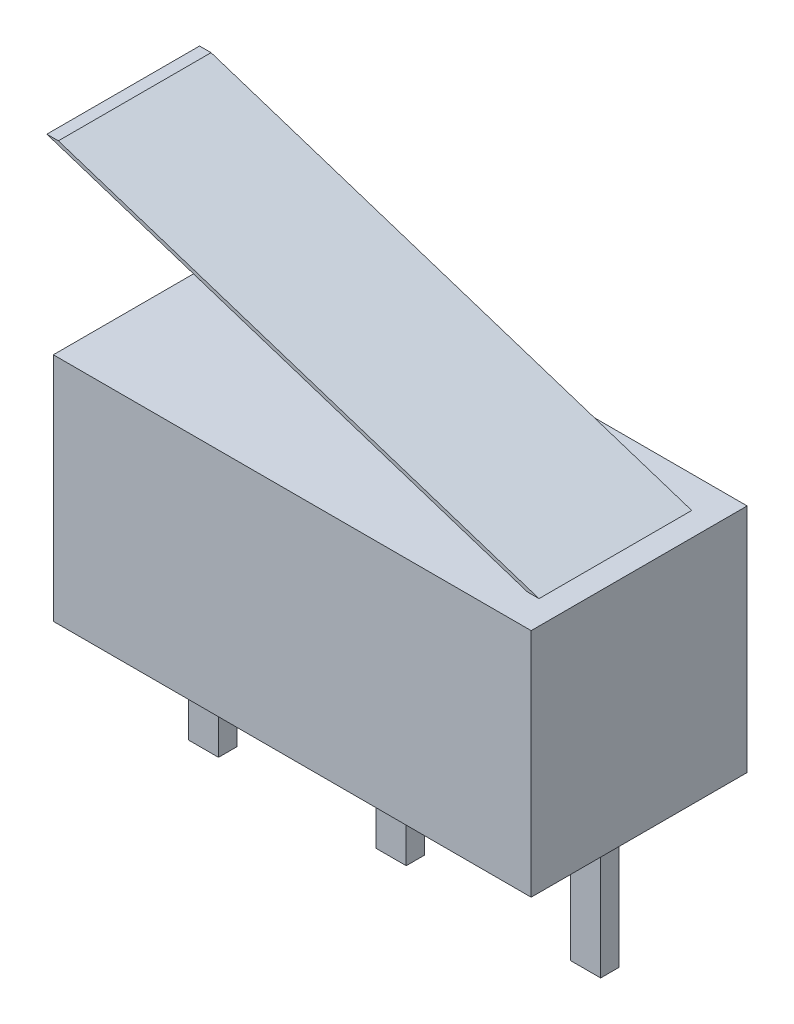
ISO-10303-21;
HEADER;
FILE_DESCRIPTION(('STEP AP214'),'2;1');
FILE_NAME('part.step','',(''),(''),'','','');
FILE_SCHEMA(('AUTOMOTIVE_DESIGN { 1 0 10303 214 1 1 1 1 }'));
ENDSEC;
DATA;
#1=APPLICATION_CONTEXT('core data for automotive mechanical design processes');
#2=APPLICATION_PROTOCOL_DEFINITION('international standard','automotive_design',2000,#1);
#3=PRODUCT_CONTEXT('',#1,'mechanical');
#4=PRODUCT('Part','Part','',(#3));
#5=PRODUCT_RELATED_PRODUCT_CATEGORY('part','',(#4));
#6=PRODUCT_DEFINITION_FORMATION('','',#4);
#7=PRODUCT_DEFINITION_CONTEXT('part definition',#1,'design');
#8=PRODUCT_DEFINITION('design','',#6,#7);
#9=PRODUCT_DEFINITION_SHAPE('','',#8);
#10=(LENGTH_UNIT() NAMED_UNIT(*) SI_UNIT(.MILLI.,.METRE.));
#11=(NAMED_UNIT(*) PLANE_ANGLE_UNIT() SI_UNIT($,.RADIAN.));
#12=(NAMED_UNIT(*) SI_UNIT($,.STERADIAN.) SOLID_ANGLE_UNIT());
#13=UNCERTAINTY_MEASURE_WITH_UNIT(LENGTH_MEASURE(1.E-05),#10,'distance_accuracy_value','');
#14=(GEOMETRIC_REPRESENTATION_CONTEXT(3) GLOBAL_UNCERTAINTY_ASSIGNED_CONTEXT((#13)) GLOBAL_UNIT_ASSIGNED_CONTEXT((#10,
#11,#12)) REPRESENTATION_CONTEXT('',''));
#15=CARTESIAN_POINT('',(0.,0.,0.));
#16=DIRECTION('',(0.,0.,1.));
#17=DIRECTION('',(1.,0.,0.));
#18=AXIS2_PLACEMENT_3D('',#15,#16,#17);
#19=CARTESIAN_POINT('',(0.,0.,0.));
#20=DIRECTION('',(0.,-1.,0.));
#21=DIRECTION('',(0.,0.,-1.));
#22=AXIS2_PLACEMENT_3D('',#19,#20,#21);
#23=PLANE('',#22);
#24=DIRECTION('',(0.,0.,-1.));
#25=VECTOR('',#24,1.);
#26=CARTESIAN_POINT('',(6.415,0.,2.9));
#27=LINE('',#26,#25);
#28=CARTESIAN_POINT('',(6.415,0.,2.9));
#29=VERTEX_POINT('',#28);
#30=CARTESIAN_POINT('',(6.415,0.,-2.9));
#31=VERTEX_POINT('',#30);
#32=EDGE_CURVE('E289',#29,#31,#27,.T.);
#33=ORIENTED_EDGE('',*,*,#32,.F.);
#34=DIRECTION('',(1.,0.,0.));
#35=VECTOR('',#34,1.);
#36=CARTESIAN_POINT('',(-6.415,0.,2.9));
#37=LINE('',#36,#35);
#38=CARTESIAN_POINT('',(-6.415,0.,2.9));
#39=VERTEX_POINT('',#38);
#40=EDGE_CURVE('E294',#39,#29,#37,.T.);
#41=ORIENTED_EDGE('',*,*,#40,.F.);
#42=DIRECTION('',(0.,0.,1.));
#43=VECTOR('',#42,1.);
#44=CARTESIAN_POINT('',(-6.415,0.,2.9));
#45=LINE('',#44,#43);
#46=CARTESIAN_POINT('',(-6.415,0.,-2.9));
#47=VERTEX_POINT('',#46);
#48=EDGE_CURVE('E305',#47,#39,#45,.T.);
#49=ORIENTED_EDGE('',*,*,#48,.F.);
#50=DIRECTION('',(-1.,0.,0.));
#51=VECTOR('',#50,1.);
#52=CARTESIAN_POINT('',(-6.415,0.,-2.9));
#53=LINE('',#52,#51);
#54=EDGE_CURVE('E303',#31,#47,#53,.T.);
#55=ORIENTED_EDGE('',*,*,#54,.F.);
#56=EDGE_LOOP('',(#33,#41,#49,#55));
#57=FACE_BOUND('',#56,.T.);
#58=DIRECTION('',(-1.,0.,0.));
#59=VECTOR('',#58,1.);
#60=CARTESIAN_POINT('',(-5.445,0.,0.245));
#61=LINE('',#60,#59);
#62=CARTESIAN_POINT('',(-4.635,0.,0.245));
#63=VERTEX_POINT('',#62);
#64=CARTESIAN_POINT('',(-5.445,0.,0.245));
#65=VERTEX_POINT('',#64);
#66=EDGE_CURVE('E242',#63,#65,#61,.T.);
#67=ORIENTED_EDGE('',*,*,#66,.F.);
#68=DIRECTION('',(0.,0.,1.));
#69=VECTOR('',#68,1.);
#70=CARTESIAN_POINT('',(-4.635,0.,-0.245));
#71=LINE('',#70,#69);
#72=CARTESIAN_POINT('',(-4.635,0.,-0.245));
#73=VERTEX_POINT('',#72);
#74=EDGE_CURVE('E228',#73,#63,#71,.T.);
#75=ORIENTED_EDGE('',*,*,#74,.F.);
#76=DIRECTION('',(1.,0.,0.));
#77=VECTOR('',#76,1.);
#78=CARTESIAN_POINT('',(-5.445,0.,-0.245));
#79=LINE('',#78,#77);
#80=CARTESIAN_POINT('',(-5.445,0.,-0.245));
#81=VERTEX_POINT('',#80);
#82=EDGE_CURVE('E233',#81,#73,#79,.T.);
#83=ORIENTED_EDGE('',*,*,#82,.F.);
#84=DIRECTION('',(0.,0.,-1.));
#85=VECTOR('',#84,1.);
#86=CARTESIAN_POINT('',(-5.445,0.,-0.245));
#87=LINE('',#86,#85);
#88=EDGE_CURVE('E244',#65,#81,#87,.T.);
#89=ORIENTED_EDGE('',*,*,#88,.F.);
#90=EDGE_LOOP('',(#67,#75,#83,#89));
#91=FACE_BOUND('',#90,.T.);
#92=DIRECTION('',(-1.,0.,0.));
#93=VECTOR('',#92,1.);
#94=CARTESIAN_POINT('',(-0.405,0.,0.245));
#95=LINE('',#94,#93);
#96=CARTESIAN_POINT('',(0.405,0.,0.245));
#97=VERTEX_POINT('',#96);
#98=CARTESIAN_POINT('',(-0.405,0.,0.245));
#99=VERTEX_POINT('',#98);
#100=EDGE_CURVE('E200',#97,#99,#95,.T.);
#101=ORIENTED_EDGE('',*,*,#100,.F.);
#102=DIRECTION('',(0.,0.,1.));
#103=VECTOR('',#102,1.);
#104=CARTESIAN_POINT('',(0.405,0.,-0.245));
#105=LINE('',#104,#103);
#106=CARTESIAN_POINT('',(0.405,0.,-0.245));
#107=VERTEX_POINT('',#106);
#108=EDGE_CURVE('E197',#107,#97,#105,.T.);
#109=ORIENTED_EDGE('',*,*,#108,.F.);
#110=DIRECTION('',(1.,0.,0.));
#111=VECTOR('',#110,1.);
#112=CARTESIAN_POINT('',(-0.405,0.,-0.245));
#113=LINE('',#112,#111);
#114=CARTESIAN_POINT('',(-0.405,0.,-0.245));
#115=VERTEX_POINT('',#114);
#116=EDGE_CURVE('E209',#115,#107,#113,.T.);
#117=ORIENTED_EDGE('',*,*,#116,.F.);
#118=DIRECTION('',(0.,0.,-1.));
#119=VECTOR('',#118,1.);
#120=CARTESIAN_POINT('',(-0.405,0.,-0.245));
#121=LINE('',#120,#119);
#122=EDGE_CURVE('E217',#99,#115,#121,.T.);
#123=ORIENTED_EDGE('',*,*,#122,.F.);
#124=EDGE_LOOP('',(#101,#109,#117,#123));
#125=FACE_BOUND('',#124,.T.);
#126=DIRECTION('',(-1.,0.,0.));
#127=VECTOR('',#126,1.);
#128=CARTESIAN_POINT('',(4.81593752789381,0.,0.245));
#129=LINE('',#128,#127);
#130=CARTESIAN_POINT('',(5.62593752789381,0.,0.245));
#131=VERTEX_POINT('',#130);
#132=CARTESIAN_POINT('',(4.81593752789381,0.,0.245));
#133=VERTEX_POINT('',#132);
#134=EDGE_CURVE('E581',#131,#133,#129,.T.);
#135=ORIENTED_EDGE('',*,*,#134,.F.);
#136=DIRECTION('',(0.,0.,1.));
#137=VECTOR('',#136,1.);
#138=CARTESIAN_POINT('',(5.62593752789381,0.,-0.245));
#139=LINE('',#138,#137);
#140=CARTESIAN_POINT('',(5.62593752789381,0.,-0.245));
#141=VERTEX_POINT('',#140);
#142=EDGE_CURVE('E195',#141,#131,#139,.T.);
#143=ORIENTED_EDGE('',*,*,#142,.F.);
#144=DIRECTION('',(1.,0.,0.));
#145=VECTOR('',#144,1.);
#146=CARTESIAN_POINT('',(4.81593752789381,0.,-0.245));
#147=LINE('',#146,#145);
#148=CARTESIAN_POINT('',(4.81593752789381,0.,-0.245));
#149=VERTEX_POINT('',#148);
#150=EDGE_CURVE('E191',#149,#141,#147,.T.);
#151=ORIENTED_EDGE('',*,*,#150,.F.);
#152=DIRECTION('',(0.,0.,-1.));
#153=VECTOR('',#152,1.);
#154=CARTESIAN_POINT('',(4.81593752789381,0.,-0.245));
#155=LINE('',#154,#153);
#156=EDGE_CURVE('E578',#133,#149,#155,.T.);
#157=ORIENTED_EDGE('',*,*,#156,.F.);
#158=EDGE_LOOP('',(#135,#143,#151,#157));
#159=FACE_BOUND('',#158,.T.);
#160=ADVANCED_FACE('F34',(#57,#91,#125,#159),#23,.T.);
#161=CARTESIAN_POINT('',(0.,6.2,0.));
#162=DIRECTION('',(0.,-1.,0.));
#163=DIRECTION('',(0.,0.,-1.));
#164=AXIS2_PLACEMENT_3D('',#161,#162,#163);
#165=PLANE('',#164);
#166=DIRECTION('',(0.,0.,-1.));
#167=VECTOR('',#166,1.);
#168=CARTESIAN_POINT('',(6.415,6.2,2.9));
#169=LINE('',#168,#167);
#170=CARTESIAN_POINT('',(6.415,6.2,2.9));
#171=VERTEX_POINT('',#170);
#172=CARTESIAN_POINT('',(6.415,6.2,-2.9));
#173=VERTEX_POINT('',#172);
#174=EDGE_CURVE('E290',#171,#173,#169,.T.);
#175=ORIENTED_EDGE('',*,*,#174,.T.);
#176=DIRECTION('',(-1.,0.,0.));
#177=VECTOR('',#176,1.);
#178=CARTESIAN_POINT('',(-6.415,6.2,-2.9));
#179=LINE('',#178,#177);
#180=CARTESIAN_POINT('',(-6.415,6.2,-2.9));
#181=VERTEX_POINT('',#180);
#182=EDGE_CURVE('E293',#173,#181,#179,.T.);
#183=ORIENTED_EDGE('',*,*,#182,.T.);
#184=DIRECTION('',(0.,0.,1.));
#185=VECTOR('',#184,1.);
#186=CARTESIAN_POINT('',(-6.415,6.2,2.9));
#187=LINE('',#186,#185);
#188=CARTESIAN_POINT('',(-6.415,6.2,2.9));
#189=VERTEX_POINT('',#188);
#190=EDGE_CURVE('E296',#181,#189,#187,.T.);
#191=ORIENTED_EDGE('',*,*,#190,.T.);
#192=DIRECTION('',(1.,0.,0.));
#193=VECTOR('',#192,1.);
#194=CARTESIAN_POINT('',(-6.415,6.2,2.9));
#195=LINE('',#194,#193);
#196=EDGE_CURVE('E298',#189,#171,#195,.T.);
#197=ORIENTED_EDGE('',*,*,#196,.T.);
#198=EDGE_LOOP('',(#175,#183,#191,#197));
#199=FACE_BOUND('',#198,.T.);
#200=DIRECTION('',(0.,0.,-1.));
#201=VECTOR('',#200,1.);
#202=CARTESIAN_POINT('',(5.77620929894976,6.2,-2.05));
#203=LINE('',#202,#201);
#204=CARTESIAN_POINT('',(5.77620929894976,6.2,2.05));
#205=VERTEX_POINT('',#204);
#206=CARTESIAN_POINT('',(5.77620929894976,6.2,-2.05));
#207=VERTEX_POINT('',#206);
#208=EDGE_CURVE('E273',#205,#207,#203,.T.);
#209=ORIENTED_EDGE('',*,*,#208,.F.);
#210=DIRECTION('',(1.,0.,0.));
#211=VECTOR('',#210,1.);
#212=CARTESIAN_POINT('',(5.46620929894976,6.2,2.05));
#213=LINE('',#212,#211);
#214=CARTESIAN_POINT('',(5.46620929894976,6.2,2.05));
#215=VERTEX_POINT('',#214);
#216=EDGE_CURVE('E260',#215,#205,#213,.T.);
#217=ORIENTED_EDGE('',*,*,#216,.F.);
#218=DIRECTION('',(0.,0.,1.));
#219=VECTOR('',#218,1.);
#220=CARTESIAN_POINT('',(5.46620929894976,6.2,-2.05));
#221=LINE('',#220,#219);
#222=CARTESIAN_POINT('',(5.46620929894976,6.2,-2.05));
#223=VERTEX_POINT('',#222);
#224=EDGE_CURVE('E257',#223,#215,#221,.T.);
#225=ORIENTED_EDGE('',*,*,#224,.F.);
#226=DIRECTION('',(-1.,0.,0.));
#227=VECTOR('',#226,1.);
#228=CARTESIAN_POINT('',(5.46620929894976,6.2,-2.05));
#229=LINE('',#228,#227);
#230=EDGE_CURVE('E270',#207,#223,#229,.T.);
#231=ORIENTED_EDGE('',*,*,#230,.F.);
#232=EDGE_LOOP('',(#209,#217,#225,#231));
#233=FACE_BOUND('',#232,.T.);
#234=ADVANCED_FACE('F332',(#199,#233),#165,.F.);
#235=CARTESIAN_POINT('',(6.415,6.2,2.9));
#236=DIRECTION('',(-1.,0.,0.));
#237=DIRECTION('',(0.,0.,1.));
#238=AXIS2_PLACEMENT_3D('',#235,#236,#237);
#239=PLANE('',#238);
#240=ORIENTED_EDGE('',*,*,#32,.T.);
#241=DIRECTION('',(0.,-1.,0.));
#242=VECTOR('',#241,1.);
#243=CARTESIAN_POINT('',(6.415,6.2,-2.9));
#244=LINE('',#243,#242);
#245=EDGE_CURVE('E11',#173,#31,#244,.T.);
#246=ORIENTED_EDGE('',*,*,#245,.F.);
#247=ORIENTED_EDGE('',*,*,#174,.F.);
#248=DIRECTION('',(0.,-1.,0.));
#249=VECTOR('',#248,1.);
#250=CARTESIAN_POINT('',(6.415,6.2,2.9));
#251=LINE('',#250,#249);
#252=EDGE_CURVE('E300',#171,#29,#251,.T.);
#253=ORIENTED_EDGE('',*,*,#252,.T.);
#254=EDGE_LOOP('',(#240,#246,#247,#253));
#255=FACE_BOUND('',#254,.T.);
#256=ADVANCED_FACE('F36',(#255),#239,.F.);
#257=CARTESIAN_POINT('',(-6.415,6.2,-2.9));
#258=DIRECTION('',(0.,0.,1.));
#259=DIRECTION('',(1.,0.,0.));
#260=AXIS2_PLACEMENT_3D('',#257,#258,#259);
#261=PLANE('',#260);
#262=ORIENTED_EDGE('',*,*,#54,.T.);
#263=DIRECTION('',(0.,-1.,0.));
#264=VECTOR('',#263,1.);
#265=CARTESIAN_POINT('',(-6.415,6.2,-2.9));
#266=LINE('',#265,#264);
#267=EDGE_CURVE('E42',#181,#47,#266,.T.);
#268=ORIENTED_EDGE('',*,*,#267,.F.);
#269=ORIENTED_EDGE('',*,*,#182,.F.);
#270=ORIENTED_EDGE('',*,*,#245,.T.);
#271=EDGE_LOOP('',(#262,#268,#269,#270));
#272=FACE_BOUND('',#271,.T.);
#273=ADVANCED_FACE('F334',(#272),#261,.F.);
#274=CARTESIAN_POINT('',(-6.415,6.2,2.9));
#275=DIRECTION('',(1.,0.,0.));
#276=DIRECTION('',(0.,0.,-1.));
#277=AXIS2_PLACEMENT_3D('',#274,#275,#276);
#278=PLANE('',#277);
#279=ORIENTED_EDGE('',*,*,#48,.T.);
#280=DIRECTION('',(0.,-1.,0.));
#281=VECTOR('',#280,1.);
#282=CARTESIAN_POINT('',(-6.415,6.2,2.9));
#283=LINE('',#282,#281);
#284=EDGE_CURVE('E310',#189,#39,#283,.T.);
#285=ORIENTED_EDGE('',*,*,#284,.F.);
#286=ORIENTED_EDGE('',*,*,#190,.F.);
#287=ORIENTED_EDGE('',*,*,#267,.T.);
#288=EDGE_LOOP('',(#279,#285,#286,#287));
#289=FACE_BOUND('',#288,.T.);
#290=ADVANCED_FACE('F317',(#289),#278,.F.);
#291=CARTESIAN_POINT('',(-6.415,6.2,2.9));
#292=DIRECTION('',(0.,0.,-1.));
#293=DIRECTION('',(-1.,0.,0.));
#294=AXIS2_PLACEMENT_3D('',#291,#292,#293);
#295=PLANE('',#294);
#296=ORIENTED_EDGE('',*,*,#40,.T.);
#297=ORIENTED_EDGE('',*,*,#252,.F.);
#298=ORIENTED_EDGE('',*,*,#196,.F.);
#299=ORIENTED_EDGE('',*,*,#284,.T.);
#300=EDGE_LOOP('',(#296,#297,#298,#299));
#301=FACE_BOUND('',#300,.T.);
#302=ADVANCED_FACE('F326',(#301),#295,.F.);
#303=CARTESIAN_POINT('',(-12.9060894719648,10.3925832778419,0.));
#304=DIRECTION('',(0.,1.,0.));
#305=DIRECTION('',(0.,0.,1.));
#306=AXIS2_PLACEMENT_3D('',#303,#304,#305);
#307=PLANE('',#306);
#308=DIRECTION('',(0.,0.,-1.));
#309=VECTOR('',#308,1.);
#310=CARTESIAN_POINT('',(-7.12988017301502,10.3925832778419,-2.05));
#311=LINE('',#310,#309);
#312=CARTESIAN_POINT('',(-7.12988017301503,10.3925832778419,2.05));
#313=VERTEX_POINT('',#312);
#314=CARTESIAN_POINT('',(-7.12988017301503,10.3925832778419,-2.05));
#315=VERTEX_POINT('',#314);
#316=EDGE_CURVE('E278',#313,#315,#311,.T.);
#317=ORIENTED_EDGE('',*,*,#316,.T.);
#318=DIRECTION('',(-1.,0.,0.));
#319=VECTOR('',#318,1.);
#320=CARTESIAN_POINT('',(-7.43988017301503,10.3925832778419,-2.05));
#321=LINE('',#320,#319);
#322=CARTESIAN_POINT('',(-7.43988017301503,10.3925832778419,-2.05));
#323=VERTEX_POINT('',#322);
#324=EDGE_CURVE('E285',#315,#323,#321,.T.);
#325=ORIENTED_EDGE('',*,*,#324,.T.);
#326=DIRECTION('',(0.,0.,1.));
#327=VECTOR('',#326,1.);
#328=CARTESIAN_POINT('',(-7.43988017301503,10.3925832778419,-2.05));
#329=LINE('',#328,#327);
#330=CARTESIAN_POINT('',(-7.43988017301503,10.3925832778419,2.05));
#331=VERTEX_POINT('',#330);
#332=EDGE_CURVE('E261',#323,#331,#329,.T.);
#333=ORIENTED_EDGE('',*,*,#332,.T.);
#334=DIRECTION('',(1.,0.,0.));
#335=VECTOR('',#334,1.);
#336=CARTESIAN_POINT('',(-7.43988017301502,10.3925832778419,2.05));
#337=LINE('',#336,#335);
#338=EDGE_CURVE('E267',#331,#313,#337,.T.);
#339=ORIENTED_EDGE('',*,*,#338,.T.);
#340=EDGE_LOOP('',(#317,#325,#333,#339));
#341=FACE_BOUND('',#340,.T.);
#342=ADVANCED_FACE('F350',(#341),#307,.T.);
#343=CARTESIAN_POINT('',(5.46620929894976,6.2,-2.05));
#344=DIRECTION('',(-0.308959710968455,-0.951075126894973,0.));
#345=DIRECTION('',(0.951075126894973,-0.308959710968455,0.));
#346=AXIS2_PLACEMENT_3D('',#343,#344,#345);
#347=PLANE('',#346);
#348=DIRECTION('',(-0.951075126894973,0.308959710968455,0.));
#349=VECTOR('',#348,1.);
#350=CARTESIAN_POINT('',(5.46620929894976,6.2,2.05));
#351=LINE('',#350,#349);
#352=EDGE_CURVE('E263',#215,#331,#351,.T.);
#353=ORIENTED_EDGE('',*,*,#352,.T.);
#354=ORIENTED_EDGE('',*,*,#332,.F.);
#355=DIRECTION('',(-0.951075126894973,0.308959710968455,0.));
#356=VECTOR('',#355,1.);
#357=CARTESIAN_POINT('',(5.46620929894976,6.2,-2.05));
#358=LINE('',#357,#356);
#359=EDGE_CURVE('E264',#223,#323,#358,.T.);
#360=ORIENTED_EDGE('',*,*,#359,.F.);
#361=ORIENTED_EDGE('',*,*,#224,.T.);
#362=EDGE_LOOP('',(#353,#354,#360,#361));
#363=FACE_BOUND('',#362,.T.);
#364=ADVANCED_FACE('F355',(#363),#347,.T.);
#365=CARTESIAN_POINT('',(5.46620929894976,6.2,2.05));
#366=DIRECTION('',(0.,0.,1.));
#367=DIRECTION('',(1.,0.,0.));
#368=AXIS2_PLACEMENT_3D('',#365,#366,#367);
#369=PLANE('',#368);
#370=DIRECTION('',(-0.951075126894973,0.308959710968455,0.));
#371=VECTOR('',#370,1.);
#372=CARTESIAN_POINT('',(5.77620929894976,6.2,2.05));
#373=LINE('',#372,#371);
#374=EDGE_CURVE('E275',#205,#313,#373,.T.);
#375=ORIENTED_EDGE('',*,*,#374,.T.);
#376=ORIENTED_EDGE('',*,*,#338,.F.);
#377=ORIENTED_EDGE('',*,*,#352,.F.);
#378=ORIENTED_EDGE('',*,*,#216,.T.);
#379=EDGE_LOOP('',(#375,#376,#377,#378));
#380=FACE_BOUND('',#379,.T.);
#381=ADVANCED_FACE('F369',(#380),#369,.T.);
#382=CARTESIAN_POINT('',(5.77620929894976,6.2,-2.05));
#383=DIRECTION('',(0.308959710968455,0.951075126894973,0.));
#384=DIRECTION('',(-0.951075126894973,0.308959710968455,0.));
#385=AXIS2_PLACEMENT_3D('',#382,#383,#384);
#386=PLANE('',#385);
#387=DIRECTION('',(-0.951075126894973,0.308959710968455,0.));
#388=VECTOR('',#387,1.);
#389=CARTESIAN_POINT('',(5.77620929894976,6.2,-2.05));
#390=LINE('',#389,#388);
#391=EDGE_CURVE('E282',#207,#315,#390,.T.);
#392=ORIENTED_EDGE('',*,*,#391,.T.);
#393=ORIENTED_EDGE('',*,*,#316,.F.);
#394=ORIENTED_EDGE('',*,*,#374,.F.);
#395=ORIENTED_EDGE('',*,*,#208,.T.);
#396=EDGE_LOOP('',(#392,#393,#394,#395));
#397=FACE_BOUND('',#396,.T.);
#398=ADVANCED_FACE('F359',(#397),#386,.T.);
#399=CARTESIAN_POINT('',(5.46620929894976,6.2,-2.05));
#400=DIRECTION('',(0.,0.,-1.));
#401=DIRECTION('',(-1.,0.,0.));
#402=AXIS2_PLACEMENT_3D('',#399,#400,#401);
#403=PLANE('',#402);
#404=ORIENTED_EDGE('',*,*,#324,.F.);
#405=ORIENTED_EDGE('',*,*,#391,.F.);
#406=ORIENTED_EDGE('',*,*,#230,.T.);
#407=ORIENTED_EDGE('',*,*,#359,.T.);
#408=EDGE_LOOP('',(#404,#405,#406,#407));
#409=FACE_BOUND('',#408,.T.);
#410=ADVANCED_FACE('F351',(#409),#403,.T.);
#411=CARTESIAN_POINT('',(-4.635,-3.6,-0.245));
#412=DIRECTION('',(-1.,0.,0.));
#413=DIRECTION('',(0.,0.,1.));
#414=AXIS2_PLACEMENT_3D('',#411,#412,#413);
#415=PLANE('',#414);
#416=ORIENTED_EDGE('',*,*,#74,.T.);
#417=DIRECTION('',(0.,1.,0.));
#418=VECTOR('',#417,1.);
#419=CARTESIAN_POINT('',(-4.635,-3.6,0.245));
#420=LINE('',#419,#418);
#421=CARTESIAN_POINT('',(-4.635,-3.6,0.245));
#422=VERTEX_POINT('',#421);
#423=EDGE_CURVE('E255',#422,#63,#420,.T.);
#424=ORIENTED_EDGE('',*,*,#423,.F.);
#425=DIRECTION('',(0.,0.,1.));
#426=VECTOR('',#425,1.);
#427=CARTESIAN_POINT('',(-4.635,-3.6,-0.245));
#428=LINE('',#427,#426);
#429=CARTESIAN_POINT('',(-4.635,-3.6,-0.245));
#430=VERTEX_POINT('',#429);
#431=EDGE_CURVE('E229',#430,#422,#428,.T.);
#432=ORIENTED_EDGE('',*,*,#431,.F.);
#433=DIRECTION('',(0.,1.,0.));
#434=VECTOR('',#433,1.);
#435=CARTESIAN_POINT('',(-4.635,-3.6,-0.245));
#436=LINE('',#435,#434);
#437=EDGE_CURVE('E239',#430,#73,#436,.T.);
#438=ORIENTED_EDGE('',*,*,#437,.T.);
#439=EDGE_LOOP('',(#416,#424,#432,#438));
#440=FACE_BOUND('',#439,.T.);
#441=ADVANCED_FACE('F357',(#440),#415,.F.);
#442=CARTESIAN_POINT('',(-5.445,-3.6,0.245));
#443=DIRECTION('',(0.,0.,-1.));
#444=DIRECTION('',(-1.,0.,0.));
#445=AXIS2_PLACEMENT_3D('',#442,#443,#444);
#446=PLANE('',#445);
#447=ORIENTED_EDGE('',*,*,#66,.T.);
#448=DIRECTION('',(0.,1.,0.));
#449=VECTOR('',#448,1.);
#450=CARTESIAN_POINT('',(-5.445,-3.6,0.245));
#451=LINE('',#450,#449);
#452=CARTESIAN_POINT('',(-5.445,-3.6,0.245));
#453=VERTEX_POINT('',#452);
#454=EDGE_CURVE('E252',#453,#65,#451,.T.);
#455=ORIENTED_EDGE('',*,*,#454,.F.);
#456=DIRECTION('',(-1.,0.,0.));
#457=VECTOR('',#456,1.);
#458=CARTESIAN_POINT('',(-5.445,-3.6,0.245));
#459=LINE('',#458,#457);
#460=EDGE_CURVE('E232',#422,#453,#459,.T.);
#461=ORIENTED_EDGE('',*,*,#460,.F.);
#462=ORIENTED_EDGE('',*,*,#423,.T.);
#463=EDGE_LOOP('',(#447,#455,#461,#462));
#464=FACE_BOUND('',#463,.T.);
#465=ADVANCED_FACE('F366',(#464),#446,.F.);
#466=CARTESIAN_POINT('',(-5.445,-3.6,-0.245));
#467=DIRECTION('',(1.,0.,0.));
#468=DIRECTION('',(0.,0.,-1.));
#469=AXIS2_PLACEMENT_3D('',#466,#467,#468);
#470=PLANE('',#469);
#471=ORIENTED_EDGE('',*,*,#88,.T.);
#472=DIRECTION('',(0.,1.,0.));
#473=VECTOR('',#472,1.);
#474=CARTESIAN_POINT('',(-5.445,-3.6,-0.245));
#475=LINE('',#474,#473);
#476=CARTESIAN_POINT('',(-5.445,-3.6,-0.245));
#477=VERTEX_POINT('',#476);
#478=EDGE_CURVE('E250',#477,#81,#475,.T.);
#479=ORIENTED_EDGE('',*,*,#478,.F.);
#480=DIRECTION('',(0.,0.,-1.));
#481=VECTOR('',#480,1.);
#482=CARTESIAN_POINT('',(-5.445,-3.6,-0.245));
#483=LINE('',#482,#481);
#484=EDGE_CURVE('E235',#453,#477,#483,.T.);
#485=ORIENTED_EDGE('',*,*,#484,.F.);
#486=ORIENTED_EDGE('',*,*,#454,.T.);
#487=EDGE_LOOP('',(#471,#479,#485,#486));
#488=FACE_BOUND('',#487,.T.);
#489=ADVANCED_FACE('F382',(#488),#470,.F.);
#490=CARTESIAN_POINT('',(-5.445,-3.6,-0.245));
#491=DIRECTION('',(0.,0.,1.));
#492=DIRECTION('',(1.,0.,0.));
#493=AXIS2_PLACEMENT_3D('',#490,#491,#492);
#494=PLANE('',#493);
#495=ORIENTED_EDGE('',*,*,#82,.T.);
#496=ORIENTED_EDGE('',*,*,#437,.F.);
#497=DIRECTION('',(1.,0.,0.));
#498=VECTOR('',#497,1.);
#499=CARTESIAN_POINT('',(-5.445,-3.6,-0.245));
#500=LINE('',#499,#498);
#501=EDGE_CURVE('E237',#477,#430,#500,.T.);
#502=ORIENTED_EDGE('',*,*,#501,.F.);
#503=ORIENTED_EDGE('',*,*,#478,.T.);
#504=EDGE_LOOP('',(#495,#496,#502,#503));
#505=FACE_BOUND('',#504,.T.);
#506=ADVANCED_FACE('F386',(#505),#494,.F.);
#507=CARTESIAN_POINT('',(0.,-3.6,0.));
#508=DIRECTION('',(0.,1.,0.));
#509=DIRECTION('',(0.,0.,1.));
#510=AXIS2_PLACEMENT_3D('',#507,#508,#509);
#511=PLANE('',#510);
#512=ORIENTED_EDGE('',*,*,#431,.T.);
#513=ORIENTED_EDGE('',*,*,#460,.T.);
#514=ORIENTED_EDGE('',*,*,#484,.T.);
#515=ORIENTED_EDGE('',*,*,#501,.T.);
#516=EDGE_LOOP('',(#512,#513,#514,#515));
#517=FACE_BOUND('',#516,.T.);
#518=ADVANCED_FACE('F390',(#517),#511,.F.);
#519=CARTESIAN_POINT('',(0.405,-3.6,-0.245));
#520=DIRECTION('',(-1.,0.,0.));
#521=DIRECTION('',(0.,0.,1.));
#522=AXIS2_PLACEMENT_3D('',#519,#520,#521);
#523=PLANE('',#522);
#524=ORIENTED_EDGE('',*,*,#108,.T.);
#525=DIRECTION('',(0.,1.,0.));
#526=VECTOR('',#525,1.);
#527=CARTESIAN_POINT('',(0.405,-3.6,0.245));
#528=LINE('',#527,#526);
#529=CARTESIAN_POINT('',(0.405,-3.6,0.245));
#530=VERTEX_POINT('',#529);
#531=EDGE_CURVE('E226',#530,#97,#528,.T.);
#532=ORIENTED_EDGE('',*,*,#531,.F.);
#533=DIRECTION('',(0.,0.,1.));
#534=VECTOR('',#533,1.);
#535=CARTESIAN_POINT('',(0.405,-3.6,-0.245));
#536=LINE('',#535,#534);
#537=CARTESIAN_POINT('',(0.405,-3.6,-0.245));
#538=VERTEX_POINT('',#537);
#539=EDGE_CURVE('E205',#538,#530,#536,.T.);
#540=ORIENTED_EDGE('',*,*,#539,.F.);
#541=DIRECTION('',(0.,1.,0.));
#542=VECTOR('',#541,1.);
#543=CARTESIAN_POINT('',(0.405,-3.6,-0.245));
#544=LINE('',#543,#542);
#545=EDGE_CURVE('E214',#538,#107,#544,.T.);
#546=ORIENTED_EDGE('',*,*,#545,.T.);
#547=EDGE_LOOP('',(#524,#532,#540,#546));
#548=FACE_BOUND('',#547,.T.);
#549=ADVANCED_FACE('F394',(#548),#523,.F.);
#550=CARTESIAN_POINT('',(-0.405,-3.6,0.245));
#551=DIRECTION('',(0.,0.,-1.));
#552=DIRECTION('',(-1.,0.,0.));
#553=AXIS2_PLACEMENT_3D('',#550,#551,#552);
#554=PLANE('',#553);
#555=ORIENTED_EDGE('',*,*,#100,.T.);
#556=DIRECTION('',(0.,1.,0.));
#557=VECTOR('',#556,1.);
#558=CARTESIAN_POINT('',(-0.405,-3.6,0.245));
#559=LINE('',#558,#557);
#560=CARTESIAN_POINT('',(-0.405,-3.6,0.245));
#561=VERTEX_POINT('',#560);
#562=EDGE_CURVE('E223',#561,#99,#559,.T.);
#563=ORIENTED_EDGE('',*,*,#562,.F.);
#564=DIRECTION('',(-1.,0.,0.));
#565=VECTOR('',#564,1.);
#566=CARTESIAN_POINT('',(-0.405,-3.6,0.245));
#567=LINE('',#566,#565);
#568=EDGE_CURVE('E208',#530,#561,#567,.T.);
#569=ORIENTED_EDGE('',*,*,#568,.F.);
#570=ORIENTED_EDGE('',*,*,#531,.T.);
#571=EDGE_LOOP('',(#555,#563,#569,#570));
#572=FACE_BOUND('',#571,.T.);
#573=ADVANCED_FACE('F398',(#572),#554,.F.);
#574=CARTESIAN_POINT('',(-0.405,-3.6,-0.245));
#575=DIRECTION('',(1.,0.,0.));
#576=DIRECTION('',(0.,0.,-1.));
#577=AXIS2_PLACEMENT_3D('',#574,#575,#576);
#578=PLANE('',#577);
#579=ORIENTED_EDGE('',*,*,#122,.T.);
#580=DIRECTION('',(0.,1.,0.));
#581=VECTOR('',#580,1.);
#582=CARTESIAN_POINT('',(-0.405,-3.6,-0.245));
#583=LINE('',#582,#581);
#584=CARTESIAN_POINT('',(-0.405,-3.6,-0.245));
#585=VERTEX_POINT('',#584);
#586=EDGE_CURVE('E57',#585,#115,#583,.T.);
#587=ORIENTED_EDGE('',*,*,#586,.F.);
#588=DIRECTION('',(0.,0.,-1.));
#589=VECTOR('',#588,1.);
#590=CARTESIAN_POINT('',(-0.405,-3.6,-0.245));
#591=LINE('',#590,#589);
#592=EDGE_CURVE('E211',#561,#585,#591,.T.);
#593=ORIENTED_EDGE('',*,*,#592,.F.);
#594=ORIENTED_EDGE('',*,*,#562,.T.);
#595=EDGE_LOOP('',(#579,#587,#593,#594));
#596=FACE_BOUND('',#595,.T.);
#597=ADVANCED_FACE('F402',(#596),#578,.F.);
#598=CARTESIAN_POINT('',(-0.405,-3.6,-0.245));
#599=DIRECTION('',(0.,0.,1.));
#600=DIRECTION('',(1.,0.,0.));
#601=AXIS2_PLACEMENT_3D('',#598,#599,#600);
#602=PLANE('',#601);
#603=ORIENTED_EDGE('',*,*,#116,.T.);
#604=ORIENTED_EDGE('',*,*,#545,.F.);
#605=DIRECTION('',(1.,0.,0.));
#606=VECTOR('',#605,1.);
#607=CARTESIAN_POINT('',(-0.405,-3.6,-0.245));
#608=LINE('',#607,#606);
#609=EDGE_CURVE('E213',#585,#538,#608,.T.);
#610=ORIENTED_EDGE('',*,*,#609,.F.);
#611=ORIENTED_EDGE('',*,*,#586,.T.);
#612=EDGE_LOOP('',(#603,#604,#610,#611));
#613=FACE_BOUND('',#612,.T.);
#614=ADVANCED_FACE('F406',(#613),#602,.F.);
#615=CARTESIAN_POINT('',(0.,-3.6,0.));
#616=DIRECTION('',(0.,1.,0.));
#617=DIRECTION('',(0.,0.,1.));
#618=AXIS2_PLACEMENT_3D('',#615,#616,#617);
#619=PLANE('',#618);
#620=ORIENTED_EDGE('',*,*,#539,.T.);
#621=ORIENTED_EDGE('',*,*,#568,.T.);
#622=ORIENTED_EDGE('',*,*,#592,.T.);
#623=ORIENTED_EDGE('',*,*,#609,.T.);
#624=EDGE_LOOP('',(#620,#621,#622,#623));
#625=FACE_BOUND('',#624,.T.);
#626=ADVANCED_FACE('F410',(#625),#619,.F.);
#627=CARTESIAN_POINT('',(5.62593752789381,-3.6,-0.245));
#628=DIRECTION('',(-1.,0.,0.));
#629=DIRECTION('',(0.,0.,1.));
#630=AXIS2_PLACEMENT_3D('',#627,#628,#629);
#631=PLANE('',#630);
#632=ORIENTED_EDGE('',*,*,#142,.T.);
#633=DIRECTION('',(0.,1.,0.));
#634=VECTOR('',#633,1.);
#635=CARTESIAN_POINT('',(5.62593752789381,-3.6,0.245));
#636=LINE('',#635,#634);
#637=CARTESIAN_POINT('',(5.62593752789381,-3.6,0.245));
#638=VERTEX_POINT('',#637);
#639=EDGE_CURVE('E176',#638,#131,#636,.T.);
#640=ORIENTED_EDGE('',*,*,#639,.F.);
#641=DIRECTION('',(0.,0.,1.));
#642=VECTOR('',#641,1.);
#643=CARTESIAN_POINT('',(5.62593752789381,-3.6,-0.245));
#644=LINE('',#643,#642);
#645=CARTESIAN_POINT('',(5.62593752789381,-3.6,-0.245));
#646=VERTEX_POINT('',#645);
#647=EDGE_CURVE('E183',#646,#638,#644,.T.);
#648=ORIENTED_EDGE('',*,*,#647,.F.);
#649=DIRECTION('',(0.,1.,0.));
#650=VECTOR('',#649,1.);
#651=CARTESIAN_POINT('',(5.62593752789381,-3.6,-0.245));
#652=LINE('',#651,#650);
#653=EDGE_CURVE('E575',#646,#141,#652,.T.);
#654=ORIENTED_EDGE('',*,*,#653,.T.);
#655=EDGE_LOOP('',(#632,#640,#648,#654));
#656=FACE_BOUND('',#655,.T.);
#657=ADVANCED_FACE('F193',(#656),#631,.F.);
#658=CARTESIAN_POINT('',(4.81593752789381,-3.6,0.245));
#659=DIRECTION('',(0.,0.,-1.));
#660=DIRECTION('',(-1.,0.,0.));
#661=AXIS2_PLACEMENT_3D('',#658,#659,#660);
#662=PLANE('',#661);
#663=ORIENTED_EDGE('',*,*,#134,.T.);
#664=DIRECTION('',(0.,1.,0.));
#665=VECTOR('',#664,1.);
#666=CARTESIAN_POINT('',(4.81593752789381,-3.6,0.245));
#667=LINE('',#666,#665);
#668=CARTESIAN_POINT('',(4.81593752789381,-3.6,0.245));
#669=VERTEX_POINT('',#668);
#670=EDGE_CURVE('E179',#669,#133,#667,.T.);
#671=ORIENTED_EDGE('',*,*,#670,.F.);
#672=DIRECTION('',(-1.,0.,0.));
#673=VECTOR('',#672,1.);
#674=CARTESIAN_POINT('',(4.81593752789381,-3.6,0.245));
#675=LINE('',#674,#673);
#676=EDGE_CURVE('E172',#638,#669,#675,.T.);
#677=ORIENTED_EDGE('',*,*,#676,.F.);
#678=ORIENTED_EDGE('',*,*,#639,.T.);
#679=EDGE_LOOP('',(#663,#671,#677,#678));
#680=FACE_BOUND('',#679,.T.);
#681=ADVANCED_FACE('F174',(#680),#662,.F.);
#682=CARTESIAN_POINT('',(4.81593752789381,-3.6,-0.245));
#683=DIRECTION('',(1.,0.,0.));
#684=DIRECTION('',(0.,0.,-1.));
#685=AXIS2_PLACEMENT_3D('',#682,#683,#684);
#686=PLANE('',#685);
#687=ORIENTED_EDGE('',*,*,#156,.T.);
#688=DIRECTION('',(0.,1.,0.));
#689=VECTOR('',#688,1.);
#690=CARTESIAN_POINT('',(4.81593752789381,-3.6,-0.245));
#691=LINE('',#690,#689);
#692=CARTESIAN_POINT('',(4.81593752789381,-3.6,-0.245));
#693=VERTEX_POINT('',#692);
#694=EDGE_CURVE('E49',#693,#149,#691,.T.);
#695=ORIENTED_EDGE('',*,*,#694,.F.);
#696=DIRECTION('',(0.,0.,-1.));
#697=VECTOR('',#696,1.);
#698=CARTESIAN_POINT('',(4.81593752789381,-3.6,-0.245));
#699=LINE('',#698,#697);
#700=EDGE_CURVE('E182',#669,#693,#699,.T.);
#701=ORIENTED_EDGE('',*,*,#700,.F.);
#702=ORIENTED_EDGE('',*,*,#670,.T.);
#703=EDGE_LOOP('',(#687,#695,#701,#702));
#704=FACE_BOUND('',#703,.T.);
#705=ADVANCED_FACE('F418',(#704),#686,.F.);
#706=CARTESIAN_POINT('',(4.81593752789381,-3.6,-0.245));
#707=DIRECTION('',(0.,0.,1.));
#708=DIRECTION('',(1.,0.,0.));
#709=AXIS2_PLACEMENT_3D('',#706,#707,#708);
#710=PLANE('',#709);
#711=ORIENTED_EDGE('',*,*,#150,.T.);
#712=ORIENTED_EDGE('',*,*,#653,.F.);
#713=DIRECTION('',(1.,0.,0.));
#714=VECTOR('',#713,1.);
#715=CARTESIAN_POINT('',(4.81593752789381,-3.6,-0.245));
#716=LINE('',#715,#714);
#717=EDGE_CURVE('E187',#693,#646,#716,.T.);
#718=ORIENTED_EDGE('',*,*,#717,.F.);
#719=ORIENTED_EDGE('',*,*,#694,.T.);
#720=EDGE_LOOP('',(#711,#712,#718,#719));
#721=FACE_BOUND('',#720,.T.);
#722=ADVANCED_FACE('F421',(#721),#710,.F.);
#723=CARTESIAN_POINT('',(0.,-3.6,0.));
#724=DIRECTION('',(0.,1.,0.));
#725=DIRECTION('',(0.,0.,1.));
#726=AXIS2_PLACEMENT_3D('',#723,#724,#725);
#727=PLANE('',#726);
#728=ORIENTED_EDGE('',*,*,#647,.T.);
#729=ORIENTED_EDGE('',*,*,#676,.T.);
#730=ORIENTED_EDGE('',*,*,#700,.T.);
#731=ORIENTED_EDGE('',*,*,#717,.T.);
#732=EDGE_LOOP('',(#728,#729,#730,#731));
#733=FACE_BOUND('',#732,.T.);
#734=ADVANCED_FACE('F186',(#733),#727,.F.);
#735=CLOSED_SHELL('',(#160,#234,#256,#273,#290,#302,#342,#364,#381,#398,#410,#441,#465,#489,
#506,#518,#549,#573,#597,#614,#626,#657,#681,#705,#722,#734));
#736=MANIFOLD_SOLID_BREP('B2',#735);
#737=ADVANCED_BREP_SHAPE_REPRESENTATION('',(#18,#736),#14);
#738=SHAPE_DEFINITION_REPRESENTATION(#9,#737);
ENDSEC;
END-ISO-10303-21;
